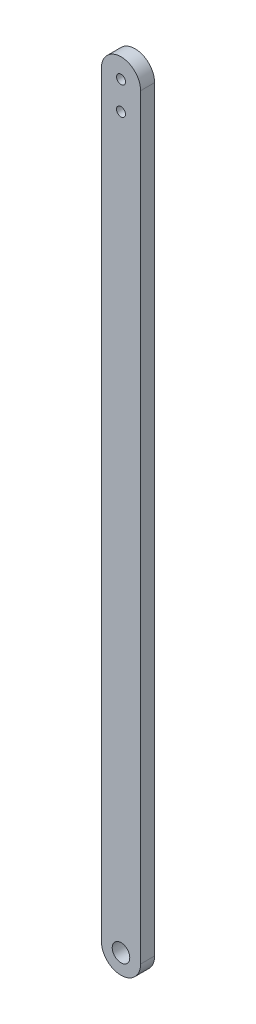
ISO-10303-21;
HEADER;
FILE_DESCRIPTION(('STEP AP214'),'2;1');
FILE_NAME('part.step','',(''),(''),'','','');
FILE_SCHEMA(('AUTOMOTIVE_DESIGN { 1 0 10303 214 1 1 1 1 }'));
ENDSEC;
DATA;
#1=APPLICATION_CONTEXT('core data for automotive mechanical design processes');
#2=APPLICATION_PROTOCOL_DEFINITION('international standard','automotive_design',2000,#1);
#3=PRODUCT_CONTEXT('',#1,'mechanical');
#4=PRODUCT('Part','Part','',(#3));
#5=PRODUCT_RELATED_PRODUCT_CATEGORY('part','',(#4));
#6=PRODUCT_DEFINITION_FORMATION('','',#4);
#7=PRODUCT_DEFINITION_CONTEXT('part definition',#1,'design');
#8=PRODUCT_DEFINITION('design','',#6,#7);
#9=PRODUCT_DEFINITION_SHAPE('','',#8);
#10=(LENGTH_UNIT() NAMED_UNIT(*) SI_UNIT(.MILLI.,.METRE.));
#11=(NAMED_UNIT(*) PLANE_ANGLE_UNIT() SI_UNIT($,.RADIAN.));
#12=(NAMED_UNIT(*) SI_UNIT($,.STERADIAN.) SOLID_ANGLE_UNIT());
#13=UNCERTAINTY_MEASURE_WITH_UNIT(LENGTH_MEASURE(1.E-05),#10,'distance_accuracy_value','');
#14=(GEOMETRIC_REPRESENTATION_CONTEXT(3) GLOBAL_UNCERTAINTY_ASSIGNED_CONTEXT((#13)) GLOBAL_UNIT_ASSIGNED_CONTEXT((#10,
#11,#12)) REPRESENTATION_CONTEXT('',''));
#15=CARTESIAN_POINT('',(0.,0.,0.));
#16=DIRECTION('',(0.,0.,1.));
#17=DIRECTION('',(1.,0.,0.));
#18=AXIS2_PLACEMENT_3D('',#15,#16,#17);
#19=CARTESIAN_POINT('',(0.,0.,5.));
#20=DIRECTION('',(0.,0.,1.));
#21=DIRECTION('',(1.,0.,0.));
#22=AXIS2_PLACEMENT_3D('',#19,#20,#21);
#23=PLANE('',#22);
#24=CARTESIAN_POINT('',(0.,270.,5.));
#25=DIRECTION('',(0.,0.,1.));
#26=DIRECTION('',(1.,0.,0.));
#27=AXIS2_PLACEMENT_3D('',#24,#25,#26);
#28=CIRCLE('',#27,1.6);
#29=CARTESIAN_POINT('',(1.6,270.,5.));
#30=VERTEX_POINT('',#29);
#31=EDGE_CURVE('E132',#30,#30,#28,.T.);
#32=ORIENTED_EDGE('',*,*,#31,.F.);
#33=EDGE_LOOP('',(#32));
#34=FACE_BOUND('',#33,.T.);
#35=CARTESIAN_POINT('',(0.,260.,5.));
#36=DIRECTION('',(0.,0.,1.));
#37=DIRECTION('',(1.,0.,0.));
#38=AXIS2_PLACEMENT_3D('',#35,#36,#37);
#39=CIRCLE('',#38,1.59999999999999);
#40=CARTESIAN_POINT('',(1.59999999999999,260.,5.));
#41=VERTEX_POINT('',#40);
#42=EDGE_CURVE('E140',#41,#41,#39,.T.);
#43=ORIENTED_EDGE('',*,*,#42,.F.);
#44=EDGE_LOOP('',(#43));
#45=FACE_BOUND('',#44,.T.);
#46=CARTESIAN_POINT('',(0.,0.,5.));
#47=DIRECTION('',(0.,0.,1.));
#48=DIRECTION('',(1.,0.,0.));
#49=AXIS2_PLACEMENT_3D('',#46,#47,#48);
#50=CIRCLE('',#49,7.00000000000002);
#51=CARTESIAN_POINT('',(-7.00000000000002,0.,5.));
#52=VERTEX_POINT('',#51);
#53=CARTESIAN_POINT('',(7.00000000000002,0.,5.));
#54=VERTEX_POINT('',#53);
#55=EDGE_CURVE('E98',#52,#54,#50,.T.);
#56=ORIENTED_EDGE('',*,*,#55,.T.);
#57=DIRECTION('',(0.,1.,0.));
#58=VECTOR('',#57,1.);
#59=CARTESIAN_POINT('',(7.,270.,5.));
#60=LINE('',#59,#58);
#61=CARTESIAN_POINT('',(6.99999999999999,270.,5.));
#62=VERTEX_POINT('',#61);
#63=EDGE_CURVE('E93',#54,#62,#60,.T.);
#64=ORIENTED_EDGE('',*,*,#63,.T.);
#65=CARTESIAN_POINT('',(0.,270.,5.));
#66=DIRECTION('',(0.,0.,1.));
#67=DIRECTION('',(1.,0.,0.));
#68=AXIS2_PLACEMENT_3D('',#65,#66,#67);
#69=CIRCLE('',#68,7.);
#70=CARTESIAN_POINT('',(-7.,270.,5.));
#71=VERTEX_POINT('',#70);
#72=EDGE_CURVE('E96',#62,#71,#69,.T.);
#73=ORIENTED_EDGE('',*,*,#72,.T.);
#74=DIRECTION('',(0.,-1.,0.));
#75=VECTOR('',#74,1.);
#76=CARTESIAN_POINT('',(-7.,270.,5.));
#77=LINE('',#76,#75);
#78=EDGE_CURVE('E63',#71,#52,#77,.T.);
#79=ORIENTED_EDGE('',*,*,#78,.T.);
#80=EDGE_LOOP('',(#56,#64,#73,#79));
#81=FACE_BOUND('',#80,.T.);
#82=CARTESIAN_POINT('',(0.,0.,5.));
#83=DIRECTION('',(0.,0.,1.));
#84=DIRECTION('',(1.,0.,0.));
#85=AXIS2_PLACEMENT_3D('',#82,#83,#84);
#86=CIRCLE('',#85,3.13055518278881);
#87=CARTESIAN_POINT('',(3.13055518278881,0.,5.));
#88=VERTEX_POINT('',#87);
#89=EDGE_CURVE('E119',#88,#88,#86,.T.);
#90=ORIENTED_EDGE('',*,*,#89,.F.);
#91=EDGE_LOOP('',(#90));
#92=FACE_BOUND('',#91,.T.);
#93=ADVANCED_FACE('F43',(#34,#45,#81,#92),#23,.T.);
#94=CARTESIAN_POINT('',(0.,0.,0.));
#95=DIRECTION('',(0.,0.,1.));
#96=DIRECTION('',(1.,0.,0.));
#97=AXIS2_PLACEMENT_3D('',#94,#95,#96);
#98=PLANE('',#97);
#99=CARTESIAN_POINT('',(0.,270.,0.));
#100=DIRECTION('',(0.,0.,1.));
#101=DIRECTION('',(1.,0.,0.));
#102=AXIS2_PLACEMENT_3D('',#99,#100,#101);
#103=CIRCLE('',#102,1.6);
#104=CARTESIAN_POINT('',(1.6,270.,0.));
#105=VERTEX_POINT('',#104);
#106=EDGE_CURVE('E47',#105,#105,#103,.T.);
#107=ORIENTED_EDGE('',*,*,#106,.T.);
#108=EDGE_LOOP('',(#107));
#109=FACE_BOUND('',#108,.T.);
#110=CARTESIAN_POINT('',(0.,260.,0.));
#111=DIRECTION('',(0.,0.,1.));
#112=DIRECTION('',(1.,0.,0.));
#113=AXIS2_PLACEMENT_3D('',#110,#111,#112);
#114=CIRCLE('',#113,1.59999999999999);
#115=CARTESIAN_POINT('',(1.59999999999999,260.,0.));
#116=VERTEX_POINT('',#115);
#117=EDGE_CURVE('E129',#116,#116,#114,.T.);
#118=ORIENTED_EDGE('',*,*,#117,.T.);
#119=EDGE_LOOP('',(#118));
#120=FACE_BOUND('',#119,.T.);
#121=CARTESIAN_POINT('',(0.,0.,0.));
#122=DIRECTION('',(0.,0.,1.));
#123=DIRECTION('',(1.,0.,0.));
#124=AXIS2_PLACEMENT_3D('',#121,#122,#123);
#125=CIRCLE('',#124,7.00000000000002);
#126=CARTESIAN_POINT('',(-7.00000000000002,0.,0.));
#127=VERTEX_POINT('',#126);
#128=CARTESIAN_POINT('',(7.00000000000002,0.,0.));
#129=VERTEX_POINT('',#128);
#130=EDGE_CURVE('E115',#127,#129,#125,.T.);
#131=ORIENTED_EDGE('',*,*,#130,.F.);
#132=DIRECTION('',(0.,-1.,0.));
#133=VECTOR('',#132,1.);
#134=CARTESIAN_POINT('',(-7.,270.,0.));
#135=LINE('',#134,#133);
#136=CARTESIAN_POINT('',(-7.,270.,0.));
#137=VERTEX_POINT('',#136);
#138=EDGE_CURVE('E86',#137,#127,#135,.T.);
#139=ORIENTED_EDGE('',*,*,#138,.F.);
#140=CARTESIAN_POINT('',(0.,270.,0.));
#141=DIRECTION('',(0.,0.,1.));
#142=DIRECTION('',(1.,0.,0.));
#143=AXIS2_PLACEMENT_3D('',#140,#141,#142);
#144=CIRCLE('',#143,7.);
#145=CARTESIAN_POINT('',(6.99999999999999,270.,0.));
#146=VERTEX_POINT('',#145);
#147=EDGE_CURVE('E80',#146,#137,#144,.T.);
#148=ORIENTED_EDGE('',*,*,#147,.F.);
#149=DIRECTION('',(0.,1.,0.));
#150=VECTOR('',#149,1.);
#151=CARTESIAN_POINT('',(7.,270.,0.));
#152=LINE('',#151,#150);
#153=EDGE_CURVE('E103',#129,#146,#152,.T.);
#154=ORIENTED_EDGE('',*,*,#153,.F.);
#155=EDGE_LOOP('',(#131,#139,#148,#154));
#156=FACE_BOUND('',#155,.T.);
#157=CARTESIAN_POINT('',(0.,0.,0.));
#158=DIRECTION('',(0.,0.,1.));
#159=DIRECTION('',(1.,0.,0.));
#160=AXIS2_PLACEMENT_3D('',#157,#158,#159);
#161=CIRCLE('',#160,3.13055518278881);
#162=CARTESIAN_POINT('',(3.13055518278881,0.,0.));
#163=VERTEX_POINT('',#162);
#164=EDGE_CURVE('E138',#163,#163,#161,.T.);
#165=ORIENTED_EDGE('',*,*,#164,.T.);
#166=EDGE_LOOP('',(#165));
#167=FACE_BOUND('',#166,.T.);
#168=ADVANCED_FACE('F156',(#109,#120,#156,#167),#98,.F.);
#169=CARTESIAN_POINT('',(0.,0.,5.));
#170=DIRECTION('',(0.,0.,-1.));
#171=DIRECTION('',(-1.,0.,0.));
#172=AXIS2_PLACEMENT_3D('',#169,#170,#171);
#173=CYLINDRICAL_SURFACE('',#172,7.00000000000002);
#174=ORIENTED_EDGE('',*,*,#130,.T.);
#175=DIRECTION('',(0.,0.,-1.));
#176=VECTOR('',#175,1.);
#177=CARTESIAN_POINT('',(7.00000000000002,0.,5.));
#178=LINE('',#177,#176);
#179=EDGE_CURVE('E11',#54,#129,#178,.T.);
#180=ORIENTED_EDGE('',*,*,#179,.F.);
#181=ORIENTED_EDGE('',*,*,#55,.F.);
#182=DIRECTION('',(0.,0.,-1.));
#183=VECTOR('',#182,1.);
#184=CARTESIAN_POINT('',(-7.00000000000002,0.,5.));
#185=LINE('',#184,#183);
#186=EDGE_CURVE('E111',#52,#127,#185,.T.);
#187=ORIENTED_EDGE('',*,*,#186,.T.);
#188=EDGE_LOOP('',(#174,#180,#181,#187));
#189=FACE_BOUND('',#188,.T.);
#190=ADVANCED_FACE('F45',(#189),#173,.T.);
#191=CARTESIAN_POINT('',(7.,270.,5.));
#192=DIRECTION('',(-1.,0.,0.));
#193=DIRECTION('',(0.,-1.,0.));
#194=AXIS2_PLACEMENT_3D('',#191,#192,#193);
#195=PLANE('',#194);
#196=ORIENTED_EDGE('',*,*,#153,.T.);
#197=DIRECTION('',(0.,0.,-1.));
#198=VECTOR('',#197,1.);
#199=CARTESIAN_POINT('',(6.99999999999999,270.,5.));
#200=LINE('',#199,#198);
#201=EDGE_CURVE('E54',#62,#146,#200,.T.);
#202=ORIENTED_EDGE('',*,*,#201,.F.);
#203=ORIENTED_EDGE('',*,*,#63,.F.);
#204=ORIENTED_EDGE('',*,*,#179,.T.);
#205=EDGE_LOOP('',(#196,#202,#203,#204));
#206=FACE_BOUND('',#205,.T.);
#207=ADVANCED_FACE('F102',(#206),#195,.F.);
#208=CARTESIAN_POINT('',(0.,270.,5.));
#209=DIRECTION('',(0.,0.,-1.));
#210=DIRECTION('',(-1.,0.,0.));
#211=AXIS2_PLACEMENT_3D('',#208,#209,#210);
#212=CYLINDRICAL_SURFACE('',#211,7.);
#213=ORIENTED_EDGE('',*,*,#147,.T.);
#214=DIRECTION('',(0.,0.,-1.));
#215=VECTOR('',#214,1.);
#216=CARTESIAN_POINT('',(-7.,270.,5.));
#217=LINE('',#216,#215);
#218=EDGE_CURVE('E105',#71,#137,#217,.T.);
#219=ORIENTED_EDGE('',*,*,#218,.F.);
#220=ORIENTED_EDGE('',*,*,#72,.F.);
#221=ORIENTED_EDGE('',*,*,#201,.T.);
#222=EDGE_LOOP('',(#213,#219,#220,#221));
#223=FACE_BOUND('',#222,.T.);
#224=ADVANCED_FACE('F107',(#223),#212,.T.);
#225=CARTESIAN_POINT('',(-7.,270.,5.));
#226=DIRECTION('',(1.,0.,0.));
#227=DIRECTION('',(0.,1.,0.));
#228=AXIS2_PLACEMENT_3D('',#225,#226,#227);
#229=PLANE('',#228);
#230=ORIENTED_EDGE('',*,*,#138,.T.);
#231=ORIENTED_EDGE('',*,*,#186,.F.);
#232=ORIENTED_EDGE('',*,*,#78,.F.);
#233=ORIENTED_EDGE('',*,*,#218,.T.);
#234=EDGE_LOOP('',(#230,#231,#232,#233));
#235=FACE_BOUND('',#234,.T.);
#236=ADVANCED_FACE('F161',(#235),#229,.F.);
#237=CARTESIAN_POINT('',(0.,0.,5.));
#238=DIRECTION('',(0.,0.,-1.));
#239=DIRECTION('',(-1.,0.,0.));
#240=AXIS2_PLACEMENT_3D('',#237,#238,#239);
#241=CYLINDRICAL_SURFACE('',#240,3.13055518278881);
#242=ORIENTED_EDGE('',*,*,#89,.T.);
#243=EDGE_LOOP('',(#242));
#244=FACE_BOUND('',#243,.T.);
#245=ORIENTED_EDGE('',*,*,#164,.F.);
#246=EDGE_LOOP('',(#245));
#247=FACE_BOUND('',#246,.T.);
#248=ADVANCED_FACE('F158',(#244,#247),#241,.F.);
#249=CARTESIAN_POINT('',(0.,260.,-5.));
#250=DIRECTION('',(0.,0.,1.));
#251=DIRECTION('',(1.,0.,0.));
#252=AXIS2_PLACEMENT_3D('',#249,#250,#251);
#253=CYLINDRICAL_SURFACE('',#252,1.59999999999999);
#254=ORIENTED_EDGE('',*,*,#42,.T.);
#255=EDGE_LOOP('',(#254));
#256=FACE_BOUND('',#255,.T.);
#257=ORIENTED_EDGE('',*,*,#117,.F.);
#258=EDGE_LOOP('',(#257));
#259=FACE_BOUND('',#258,.T.);
#260=ADVANCED_FACE('F160',(#256,#259),#253,.F.);
#261=CARTESIAN_POINT('',(0.,270.,-5.));
#262=DIRECTION('',(0.,0.,1.));
#263=DIRECTION('',(1.,0.,0.));
#264=AXIS2_PLACEMENT_3D('',#261,#262,#263);
#265=CYLINDRICAL_SURFACE('',#264,1.6);
#266=ORIENTED_EDGE('',*,*,#31,.T.);
#267=EDGE_LOOP('',(#266));
#268=FACE_BOUND('',#267,.T.);
#269=ORIENTED_EDGE('',*,*,#106,.F.);
#270=EDGE_LOOP('',(#269));
#271=FACE_BOUND('',#270,.T.);
#272=ADVANCED_FACE('F168',(#268,#271),#265,.F.);
#273=CLOSED_SHELL('',(#93,#168,#190,#207,#224,#236,#248,#260,#272));
#274=MANIFOLD_SOLID_BREP('B2',#273);
#275=ADVANCED_BREP_SHAPE_REPRESENTATION('',(#18,#274),#14);
#276=SHAPE_DEFINITION_REPRESENTATION(#9,#275);
ENDSEC;
END-ISO-10303-21;
